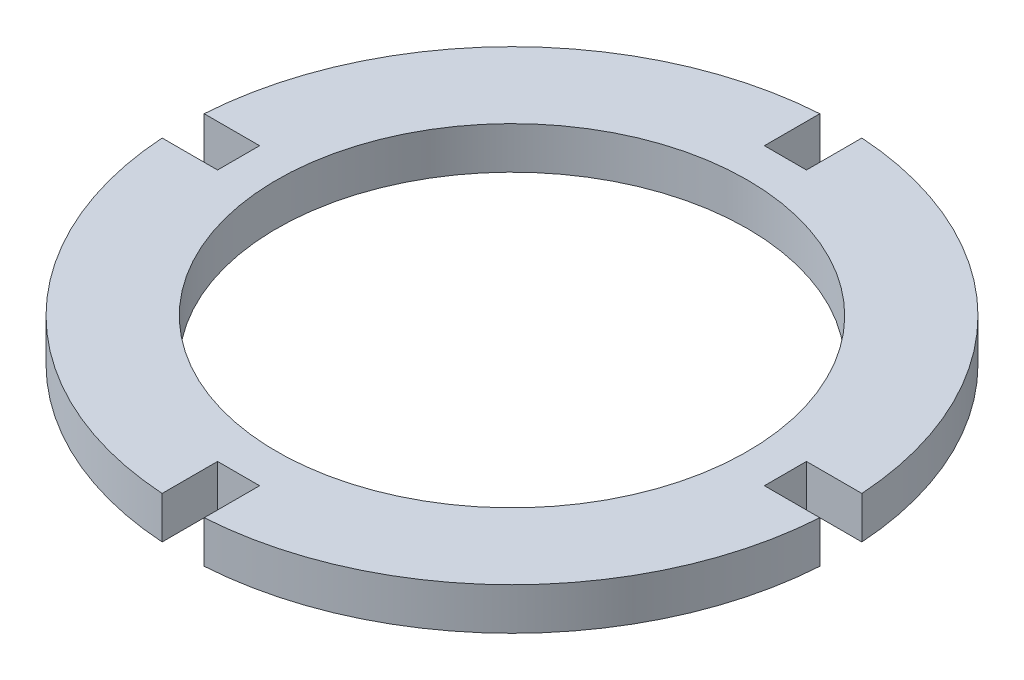
ISO-10303-21;
HEADER;
FILE_DESCRIPTION(('STEP AP214'),'2;1');
FILE_NAME('part.step','',(''),(''),'','','');
FILE_SCHEMA(('AUTOMOTIVE_DESIGN { 1 0 10303 214 1 1 1 1 }'));
ENDSEC;
DATA;
#1=APPLICATION_CONTEXT('core data for automotive mechanical design processes');
#2=APPLICATION_PROTOCOL_DEFINITION('international standard','automotive_design',2000,#1);
#3=PRODUCT_CONTEXT('',#1,'mechanical');
#4=PRODUCT('Part','Part','',(#3));
#5=PRODUCT_RELATED_PRODUCT_CATEGORY('part','',(#4));
#6=PRODUCT_DEFINITION_FORMATION('','',#4);
#7=PRODUCT_DEFINITION_CONTEXT('part definition',#1,'design');
#8=PRODUCT_DEFINITION('design','',#6,#7);
#9=PRODUCT_DEFINITION_SHAPE('','',#8);
#10=(LENGTH_UNIT() NAMED_UNIT(*) SI_UNIT(.MILLI.,.METRE.));
#11=(NAMED_UNIT(*) PLANE_ANGLE_UNIT() SI_UNIT($,.RADIAN.));
#12=(NAMED_UNIT(*) SI_UNIT($,.STERADIAN.) SOLID_ANGLE_UNIT());
#13=UNCERTAINTY_MEASURE_WITH_UNIT(LENGTH_MEASURE(1.E-05),#10,'distance_accuracy_value','');
#14=(GEOMETRIC_REPRESENTATION_CONTEXT(3) GLOBAL_UNCERTAINTY_ASSIGNED_CONTEXT((#13)) GLOBAL_UNIT_ASSIGNED_CONTEXT((#10,
#11,#12)) REPRESENTATION_CONTEXT('',''));
#15=CARTESIAN_POINT('',(0.,0.,0.));
#16=DIRECTION('',(0.,0.,1.));
#17=DIRECTION('',(1.,0.,0.));
#18=AXIS2_PLACEMENT_3D('',#15,#16,#17);
#19=CARTESIAN_POINT('',(0.,3.,0.));
#20=DIRECTION('',(0.,-1.,0.));
#21=DIRECTION('',(0.,0.,-1.));
#22=AXIS2_PLACEMENT_3D('',#19,#20,#21);
#23=CYLINDRICAL_SURFACE('',#22,23.5);
#24=CARTESIAN_POINT('',(0.,0.,0.));
#25=DIRECTION('',(0.,1.,0.));
#26=DIRECTION('',(0.,0.,1.));
#27=AXIS2_PLACEMENT_3D('',#24,#25,#26);
#28=CIRCLE('',#27,23.5);
#29=CARTESIAN_POINT('',(1.49999999999992,0.,23.4520787991172));
#30=VERTEX_POINT('',#29);
#31=CARTESIAN_POINT('',(23.4520787991172,0.,1.5));
#32=VERTEX_POINT('',#31);
#33=EDGE_CURVE('E260',#30,#32,#28,.T.);
#34=ORIENTED_EDGE('',*,*,#33,.T.);
#35=DIRECTION('',(0.,-1.,0.));
#36=VECTOR('',#35,1.);
#37=CARTESIAN_POINT('',(23.4520787991172,3.,1.5));
#38=LINE('',#37,#36);
#39=CARTESIAN_POINT('',(23.4520787991172,3.,1.5));
#40=VERTEX_POINT('',#39);
#41=EDGE_CURVE('E160',#32,#40,#38,.F.);
#42=ORIENTED_EDGE('',*,*,#41,.T.);
#43=CARTESIAN_POINT('',(0.,3.,0.));
#44=DIRECTION('',(0.,1.,0.));
#45=DIRECTION('',(0.,0.,1.));
#46=AXIS2_PLACEMENT_3D('',#43,#44,#45);
#47=CIRCLE('',#46,23.5);
#48=CARTESIAN_POINT('',(1.49999999999992,3.,23.4520787991172));
#49=VERTEX_POINT('',#48);
#50=EDGE_CURVE('E254',#49,#40,#47,.T.);
#51=ORIENTED_EDGE('',*,*,#50,.F.);
#52=DIRECTION('',(0.,-1.,0.));
#53=VECTOR('',#52,1.);
#54=CARTESIAN_POINT('',(1.49999999999992,3.,23.4520787991172));
#55=LINE('',#54,#53);
#56=EDGE_CURVE('E237',#49,#30,#55,.T.);
#57=ORIENTED_EDGE('',*,*,#56,.T.);
#58=EDGE_LOOP('',(#34,#42,#51,#57));
#59=FACE_BOUND('',#58,.T.);
#60=ADVANCED_FACE('F33',(#59),#23,.T.);
#61=CARTESIAN_POINT('',(-23.4520787991172,0.,1.49999999999984));
#62=VERTEX_POINT('',#61);
#63=CARTESIAN_POINT('',(-1.50000000000008,0.,23.4520787991171));
#64=VERTEX_POINT('',#63);
#65=EDGE_CURVE('E251',#62,#64,#28,.T.);
#66=ORIENTED_EDGE('',*,*,#65,.T.);
#67=DIRECTION('',(0.,-1.,0.));
#68=VECTOR('',#67,1.);
#69=CARTESIAN_POINT('',(-1.50000000000008,3.,23.4520787991171));
#70=LINE('',#69,#68);
#71=CARTESIAN_POINT('',(-1.50000000000008,3.,23.4520787991171));
#72=VERTEX_POINT('',#71);
#73=EDGE_CURVE('E240',#64,#72,#70,.F.);
#74=ORIENTED_EDGE('',*,*,#73,.T.);
#75=CARTESIAN_POINT('',(-23.4520787991172,3.,1.49999999999984));
#76=VERTEX_POINT('',#75);
#77=EDGE_CURVE('E259',#76,#72,#47,.T.);
#78=ORIENTED_EDGE('',*,*,#77,.F.);
#79=DIRECTION('',(0.,-1.,0.));
#80=VECTOR('',#79,1.);
#81=CARTESIAN_POINT('',(-23.4520787991172,3.,1.49999999999984));
#82=LINE('',#81,#80);
#83=EDGE_CURVE('E231',#76,#62,#82,.T.);
#84=ORIENTED_EDGE('',*,*,#83,.T.);
#85=EDGE_LOOP('',(#66,#74,#78,#84));
#86=FACE_BOUND('',#85,.T.);
#87=ADVANCED_FACE('F287',(#86),#23,.T.);
#88=CARTESIAN_POINT('',(-1.49999999999975,0.,-23.4520787991172));
#89=VERTEX_POINT('',#88);
#90=CARTESIAN_POINT('',(-23.4520787991171,0.,-1.50000000000016));
#91=VERTEX_POINT('',#90);
#92=EDGE_CURVE('E289',#89,#91,#28,.T.);
#93=ORIENTED_EDGE('',*,*,#92,.T.);
#94=DIRECTION('',(0.,-1.,0.));
#95=VECTOR('',#94,1.);
#96=CARTESIAN_POINT('',(-23.4520787991171,3.,-1.50000000000016));
#97=LINE('',#96,#95);
#98=CARTESIAN_POINT('',(-23.4520787991171,3.,-1.50000000000016));
#99=VERTEX_POINT('',#98);
#100=EDGE_CURVE('E234',#91,#99,#97,.F.);
#101=ORIENTED_EDGE('',*,*,#100,.T.);
#102=CARTESIAN_POINT('',(-1.49999999999975,3.,-23.4520787991172));
#103=VERTEX_POINT('',#102);
#104=EDGE_CURVE('E304',#103,#99,#47,.T.);
#105=ORIENTED_EDGE('',*,*,#104,.F.);
#106=DIRECTION('',(0.,-1.,0.));
#107=VECTOR('',#106,1.);
#108=CARTESIAN_POINT('',(-1.49999999999975,3.,-23.4520787991172));
#109=LINE('',#108,#107);
#110=EDGE_CURVE('E153',#103,#89,#109,.T.);
#111=ORIENTED_EDGE('',*,*,#110,.T.);
#112=EDGE_LOOP('',(#93,#101,#105,#111));
#113=FACE_BOUND('',#112,.T.);
#114=ADVANCED_FACE('F309',(#113),#23,.T.);
#115=CARTESIAN_POINT('',(23.4520787991172,3.,-1.5));
#116=VERTEX_POINT('',#115);
#117=CARTESIAN_POINT('',(1.50000000000025,3.,-23.4520787991171));
#118=VERTEX_POINT('',#117);
#119=EDGE_CURVE('E258',#116,#118,#47,.T.);
#120=ORIENTED_EDGE('',*,*,#119,.F.);
#121=DIRECTION('',(0.,-1.,0.));
#122=VECTOR('',#121,1.);
#123=CARTESIAN_POINT('',(23.4520787991172,3.,-1.5));
#124=LINE('',#123,#122);
#125=CARTESIAN_POINT('',(23.4520787991172,0.,-1.5));
#126=VERTEX_POINT('',#125);
#127=EDGE_CURVE('E243',#116,#126,#124,.T.);
#128=ORIENTED_EDGE('',*,*,#127,.T.);
#129=CARTESIAN_POINT('',(1.50000000000025,0.,-23.4520787991171));
#130=VERTEX_POINT('',#129);
#131=EDGE_CURVE('E262',#126,#130,#28,.T.);
#132=ORIENTED_EDGE('',*,*,#131,.T.);
#133=DIRECTION('',(0.,-1.,0.));
#134=VECTOR('',#133,1.);
#135=CARTESIAN_POINT('',(1.50000000000025,3.,-23.4520787991171));
#136=LINE('',#135,#134);
#137=EDGE_CURVE('E228',#130,#118,#136,.F.);
#138=ORIENTED_EDGE('',*,*,#137,.T.);
#139=EDGE_LOOP('',(#120,#128,#132,#138));
#140=FACE_BOUND('',#139,.T.);
#141=ADVANCED_FACE('F35',(#140),#23,.T.);
#142=CARTESIAN_POINT('',(0.,3.,0.));
#143=DIRECTION('',(0.,1.,0.));
#144=DIRECTION('',(0.,0.,1.));
#145=AXIS2_PLACEMENT_3D('',#142,#143,#144);
#146=PLANE('',#145);
#147=DIRECTION('',(1.,0.,0.));
#148=VECTOR('',#147,1.);
#149=CARTESIAN_POINT('',(19.5,3.,1.5));
#150=LINE('',#149,#148);
#151=CARTESIAN_POINT('',(19.5,3.,1.5));
#152=VERTEX_POINT('',#151);
#153=EDGE_CURVE('E167',#152,#40,#150,.T.);
#154=ORIENTED_EDGE('',*,*,#153,.F.);
#155=DIRECTION('',(0.,0.,1.));
#156=VECTOR('',#155,1.);
#157=CARTESIAN_POINT('',(19.5,3.,-1.5));
#158=LINE('',#157,#156);
#159=CARTESIAN_POINT('',(19.5,3.,-1.5));
#160=VERTEX_POINT('',#159);
#161=EDGE_CURVE('E150',#160,#152,#158,.T.);
#162=ORIENTED_EDGE('',*,*,#161,.F.);
#163=DIRECTION('',(-1.,0.,0.));
#164=VECTOR('',#163,1.);
#165=CARTESIAN_POINT('',(19.5,3.,-1.5));
#166=LINE('',#165,#164);
#167=EDGE_CURVE('E171',#116,#160,#166,.T.);
#168=ORIENTED_EDGE('',*,*,#167,.F.);
#169=ORIENTED_EDGE('',*,*,#119,.T.);
#170=DIRECTION('',(0.,0.,-1.));
#171=VECTOR('',#170,1.);
#172=CARTESIAN_POINT('',(1.50000000000021,3.,-19.5));
#173=LINE('',#172,#171);
#174=CARTESIAN_POINT('',(1.50000000000021,3.,-19.5));
#175=VERTEX_POINT('',#174);
#176=EDGE_CURVE('E217',#175,#118,#173,.T.);
#177=ORIENTED_EDGE('',*,*,#176,.F.);
#178=DIRECTION('',(1.,0.,0.));
#179=VECTOR('',#178,1.);
#180=CARTESIAN_POINT('',(-1.49999999999979,3.,-19.5));
#181=LINE('',#180,#179);
#182=CARTESIAN_POINT('',(-1.49999999999979,3.,-19.5));
#183=VERTEX_POINT('',#182);
#184=EDGE_CURVE('E213',#183,#175,#181,.T.);
#185=ORIENTED_EDGE('',*,*,#184,.F.);
#186=DIRECTION('',(0.,0.,1.));
#187=VECTOR('',#186,1.);
#188=CARTESIAN_POINT('',(-1.49999999999979,3.,-19.5));
#189=LINE('',#188,#187);
#190=EDGE_CURVE('E219',#103,#183,#189,.T.);
#191=ORIENTED_EDGE('',*,*,#190,.F.);
#192=ORIENTED_EDGE('',*,*,#104,.T.);
#193=DIRECTION('',(-1.,0.,0.));
#194=VECTOR('',#193,1.);
#195=CARTESIAN_POINT('',(-19.5,3.,-1.50000000000014));
#196=LINE('',#195,#194);
#197=CARTESIAN_POINT('',(-19.5,3.,-1.50000000000014));
#198=VERTEX_POINT('',#197);
#199=EDGE_CURVE('E199',#198,#99,#196,.T.);
#200=ORIENTED_EDGE('',*,*,#199,.F.);
#201=DIRECTION('',(0.,0.,-1.));
#202=VECTOR('',#201,1.);
#203=CARTESIAN_POINT('',(-19.5,3.,1.49999999999986));
#204=LINE('',#203,#202);
#205=CARTESIAN_POINT('',(-19.5,3.,1.49999999999986));
#206=VERTEX_POINT('',#205);
#207=EDGE_CURVE('E195',#206,#198,#204,.T.);
#208=ORIENTED_EDGE('',*,*,#207,.F.);
#209=DIRECTION('',(1.,0.,0.));
#210=VECTOR('',#209,1.);
#211=CARTESIAN_POINT('',(-19.5,3.,1.49999999999986));
#212=LINE('',#211,#210);
#213=EDGE_CURVE('E201',#76,#206,#212,.T.);
#214=ORIENTED_EDGE('',*,*,#213,.F.);
#215=ORIENTED_EDGE('',*,*,#77,.T.);
#216=DIRECTION('',(0.,0.,1.));
#217=VECTOR('',#216,1.);
#218=CARTESIAN_POINT('',(-1.50000000000007,3.,19.5));
#219=LINE('',#218,#217);
#220=CARTESIAN_POINT('',(-1.50000000000007,3.,19.5));
#221=VERTEX_POINT('',#220);
#222=EDGE_CURVE('E182',#221,#72,#219,.T.);
#223=ORIENTED_EDGE('',*,*,#222,.F.);
#224=DIRECTION('',(-1.,0.,0.));
#225=VECTOR('',#224,1.);
#226=CARTESIAN_POINT('',(1.49999999999993,3.,19.5));
#227=LINE('',#226,#225);
#228=CARTESIAN_POINT('',(1.49999999999993,3.,19.5));
#229=VERTEX_POINT('',#228);
#230=EDGE_CURVE('E179',#229,#221,#227,.T.);
#231=ORIENTED_EDGE('',*,*,#230,.F.);
#232=DIRECTION('',(0.,0.,-1.));
#233=VECTOR('',#232,1.);
#234=CARTESIAN_POINT('',(1.49999999999993,3.,19.5));
#235=LINE('',#234,#233);
#236=EDGE_CURVE('E184',#49,#229,#235,.T.);
#237=ORIENTED_EDGE('',*,*,#236,.F.);
#238=ORIENTED_EDGE('',*,*,#50,.T.);
#239=EDGE_LOOP('',(#154,#162,#168,#169,#177,#185,#191,#192,#200,#208,#214,#215,#223,#231,#237,#238));
#240=FACE_BOUND('',#239,.T.);
#241=CARTESIAN_POINT('',(0.,3.,0.));
#242=DIRECTION('',(0.,-1.,0.));
#243=DIRECTION('',(0.,0.,-1.));
#244=AXIS2_PLACEMENT_3D('',#241,#242,#243);
#245=CIRCLE('',#244,16.78);
#246=CARTESIAN_POINT('',(0.,3.,-16.78));
#247=VERTEX_POINT('',#246);
#248=EDGE_CURVE('E248',#247,#247,#245,.T.);
#249=ORIENTED_EDGE('',*,*,#248,.T.);
#250=EDGE_LOOP('',(#249));
#251=FACE_BOUND('',#250,.T.);
#252=ADVANCED_FACE('F274',(#240,#251),#146,.T.);
#253=CARTESIAN_POINT('',(0.,0.,0.));
#254=DIRECTION('',(0.,1.,0.));
#255=DIRECTION('',(0.,0.,1.));
#256=AXIS2_PLACEMENT_3D('',#253,#254,#255);
#257=PLANE('',#256);
#258=CARTESIAN_POINT('',(0.,0.,0.));
#259=DIRECTION('',(0.,-1.,0.));
#260=DIRECTION('',(0.,0.,-1.));
#261=AXIS2_PLACEMENT_3D('',#258,#259,#260);
#262=CIRCLE('',#261,16.78);
#263=CARTESIAN_POINT('',(0.,0.,-16.78));
#264=VERTEX_POINT('',#263);
#265=EDGE_CURVE('E247',#264,#264,#262,.T.);
#266=ORIENTED_EDGE('',*,*,#265,.F.);
#267=EDGE_LOOP('',(#266));
#268=FACE_BOUND('',#267,.T.);
#269=DIRECTION('',(0.,0.,1.));
#270=VECTOR('',#269,1.);
#271=CARTESIAN_POINT('',(19.5,0.,-1.5));
#272=LINE('',#271,#270);
#273=CARTESIAN_POINT('',(19.5,0.,-1.5));
#274=VERTEX_POINT('',#273);
#275=CARTESIAN_POINT('',(19.5,0.,1.5));
#276=VERTEX_POINT('',#275);
#277=EDGE_CURVE('E48',#274,#276,#272,.T.);
#278=ORIENTED_EDGE('',*,*,#277,.T.);
#279=DIRECTION('',(1.,0.,0.));
#280=VECTOR('',#279,1.);
#281=CARTESIAN_POINT('',(19.5,0.,1.5));
#282=LINE('',#281,#280);
#283=EDGE_CURVE('E157',#276,#32,#282,.T.);
#284=ORIENTED_EDGE('',*,*,#283,.T.);
#285=ORIENTED_EDGE('',*,*,#33,.F.);
#286=DIRECTION('',(0.,0.,-1.));
#287=VECTOR('',#286,1.);
#288=CARTESIAN_POINT('',(1.5,0.,0.));
#289=LINE('',#288,#287);
#290=CARTESIAN_POINT('',(1.49999999999993,0.,19.5));
#291=VERTEX_POINT('',#290);
#292=EDGE_CURVE('E41',#30,#291,#289,.T.);
#293=ORIENTED_EDGE('',*,*,#292,.T.);
#294=DIRECTION('',(-1.,0.,0.));
#295=VECTOR('',#294,1.);
#296=CARTESIAN_POINT('',(1.49999999999993,0.,19.5));
#297=LINE('',#296,#295);
#298=CARTESIAN_POINT('',(-1.50000000000007,0.,19.5));
#299=VERTEX_POINT('',#298);
#300=EDGE_CURVE('E56',#291,#299,#297,.T.);
#301=ORIENTED_EDGE('',*,*,#300,.T.);
#302=DIRECTION('',(0.,0.,1.));
#303=VECTOR('',#302,1.);
#304=CARTESIAN_POINT('',(-1.50000000000007,0.,19.5));
#305=LINE('',#304,#303);
#306=EDGE_CURVE('E176',#299,#64,#305,.T.);
#307=ORIENTED_EDGE('',*,*,#306,.T.);
#308=ORIENTED_EDGE('',*,*,#65,.F.);
#309=DIRECTION('',(1.,0.,0.));
#310=VECTOR('',#309,1.);
#311=CARTESIAN_POINT('',(0.,0.,1.5));
#312=LINE('',#311,#310);
#313=CARTESIAN_POINT('',(-19.5,0.,1.49999999999986));
#314=VERTEX_POINT('',#313);
#315=EDGE_CURVE('E265',#62,#314,#312,.T.);
#316=ORIENTED_EDGE('',*,*,#315,.T.);
#317=DIRECTION('',(0.,0.,-1.));
#318=VECTOR('',#317,1.);
#319=CARTESIAN_POINT('',(-19.5,0.,1.49999999999986));
#320=LINE('',#319,#318);
#321=CARTESIAN_POINT('',(-19.5,0.,-1.50000000000014));
#322=VERTEX_POINT('',#321);
#323=EDGE_CURVE('E194',#314,#322,#320,.T.);
#324=ORIENTED_EDGE('',*,*,#323,.T.);
#325=DIRECTION('',(-1.,0.,0.));
#326=VECTOR('',#325,1.);
#327=CARTESIAN_POINT('',(-19.5,0.,-1.50000000000014));
#328=LINE('',#327,#326);
#329=EDGE_CURVE('E191',#322,#91,#328,.T.);
#330=ORIENTED_EDGE('',*,*,#329,.T.);
#331=ORIENTED_EDGE('',*,*,#92,.F.);
#332=DIRECTION('',(0.,0.,1.));
#333=VECTOR('',#332,1.);
#334=CARTESIAN_POINT('',(-1.5,0.,0.));
#335=LINE('',#334,#333);
#336=CARTESIAN_POINT('',(-1.49999999999979,0.,-19.5));
#337=VERTEX_POINT('',#336);
#338=EDGE_CURVE('E257',#89,#337,#335,.T.);
#339=ORIENTED_EDGE('',*,*,#338,.T.);
#340=DIRECTION('',(1.,0.,0.));
#341=VECTOR('',#340,1.);
#342=CARTESIAN_POINT('',(-1.49999999999979,0.,-19.5));
#343=LINE('',#342,#341);
#344=CARTESIAN_POINT('',(1.50000000000021,0.,-19.5));
#345=VERTEX_POINT('',#344);
#346=EDGE_CURVE('E212',#337,#345,#343,.T.);
#347=ORIENTED_EDGE('',*,*,#346,.T.);
#348=DIRECTION('',(0.,0.,-1.));
#349=VECTOR('',#348,1.);
#350=CARTESIAN_POINT('',(1.50000000000021,0.,-19.5));
#351=LINE('',#350,#349);
#352=EDGE_CURVE('E209',#345,#130,#351,.T.);
#353=ORIENTED_EDGE('',*,*,#352,.T.);
#354=ORIENTED_EDGE('',*,*,#131,.F.);
#355=DIRECTION('',(-1.,0.,0.));
#356=VECTOR('',#355,1.);
#357=CARTESIAN_POINT('',(0.,0.,-1.5));
#358=LINE('',#357,#356);
#359=EDGE_CURVE('E11',#126,#274,#358,.T.);
#360=ORIENTED_EDGE('',*,*,#359,.T.);
#361=EDGE_LOOP('',(#278,#284,#285,#293,#301,#307,#308,#316,#324,#330,#331,#339,#347,#353,#354,#360));
#362=FACE_BOUND('',#361,.T.);
#363=ADVANCED_FACE('F165',(#268,#362),#257,.F.);
#364=CARTESIAN_POINT('',(0.,3.,0.));
#365=DIRECTION('',(0.,-1.,0.));
#366=DIRECTION('',(0.,0.,-1.));
#367=AXIS2_PLACEMENT_3D('',#364,#365,#366);
#368=CYLINDRICAL_SURFACE('',#367,16.78);
#369=ORIENTED_EDGE('',*,*,#248,.F.);
#370=EDGE_LOOP('',(#369));
#371=FACE_BOUND('',#370,.T.);
#372=ORIENTED_EDGE('',*,*,#265,.T.);
#373=EDGE_LOOP('',(#372));
#374=FACE_BOUND('',#373,.T.);
#375=ADVANCED_FACE('F353',(#371,#374),#368,.F.);
#376=CARTESIAN_POINT('',(1.50000000000021,0.,-19.5));
#377=DIRECTION('',(1.,0.,0.));
#378=DIRECTION('',(0.,0.,-1.));
#379=AXIS2_PLACEMENT_3D('',#376,#377,#378);
#380=PLANE('',#379);
#381=ORIENTED_EDGE('',*,*,#352,.F.);
#382=DIRECTION('',(0.,1.,0.));
#383=VECTOR('',#382,1.);
#384=CARTESIAN_POINT('',(1.50000000000021,0.,-19.5));
#385=LINE('',#384,#383);
#386=EDGE_CURVE('E202',#345,#175,#385,.T.);
#387=ORIENTED_EDGE('',*,*,#386,.T.);
#388=ORIENTED_EDGE('',*,*,#176,.T.);
#389=ORIENTED_EDGE('',*,*,#137,.F.);
#390=EDGE_LOOP('',(#381,#387,#388,#389));
#391=FACE_BOUND('',#390,.T.);
#392=ADVANCED_FACE('F299',(#391),#380,.F.);
#393=CARTESIAN_POINT('',(-1.49999999999979,0.,-19.5));
#394=DIRECTION('',(-1.,0.,0.));
#395=DIRECTION('',(0.,0.,1.));
#396=AXIS2_PLACEMENT_3D('',#393,#394,#395);
#397=PLANE('',#396);
#398=ORIENTED_EDGE('',*,*,#190,.T.);
#399=DIRECTION('',(0.,1.,0.));
#400=VECTOR('',#399,1.);
#401=CARTESIAN_POINT('',(-1.49999999999979,0.,-19.5));
#402=LINE('',#401,#400);
#403=EDGE_CURVE('E216',#337,#183,#402,.T.);
#404=ORIENTED_EDGE('',*,*,#403,.F.);
#405=ORIENTED_EDGE('',*,*,#338,.F.);
#406=ORIENTED_EDGE('',*,*,#110,.F.);
#407=EDGE_LOOP('',(#398,#404,#405,#406));
#408=FACE_BOUND('',#407,.T.);
#409=ADVANCED_FACE('F370',(#408),#397,.F.);
#410=CARTESIAN_POINT('',(-1.49999999999979,0.,-19.5));
#411=DIRECTION('',(0.,0.,1.));
#412=DIRECTION('',(1.,0.,0.));
#413=AXIS2_PLACEMENT_3D('',#410,#411,#412);
#414=PLANE('',#413);
#415=ORIENTED_EDGE('',*,*,#184,.T.);
#416=ORIENTED_EDGE('',*,*,#386,.F.);
#417=ORIENTED_EDGE('',*,*,#346,.F.);
#418=ORIENTED_EDGE('',*,*,#403,.T.);
#419=EDGE_LOOP('',(#415,#416,#417,#418));
#420=FACE_BOUND('',#419,.T.);
#421=ADVANCED_FACE('F325',(#420),#414,.F.);
#422=CARTESIAN_POINT('',(-19.5,0.,-1.50000000000014));
#423=DIRECTION('',(0.,0.,-1.));
#424=DIRECTION('',(-1.,0.,0.));
#425=AXIS2_PLACEMENT_3D('',#422,#423,#424);
#426=PLANE('',#425);
#427=ORIENTED_EDGE('',*,*,#329,.F.);
#428=DIRECTION('',(0.,1.,0.));
#429=VECTOR('',#428,1.);
#430=CARTESIAN_POINT('',(-19.5,0.,-1.50000000000014));
#431=LINE('',#430,#429);
#432=EDGE_CURVE('E185',#322,#198,#431,.T.);
#433=ORIENTED_EDGE('',*,*,#432,.T.);
#434=ORIENTED_EDGE('',*,*,#199,.T.);
#435=ORIENTED_EDGE('',*,*,#100,.F.);
#436=EDGE_LOOP('',(#427,#433,#434,#435));
#437=FACE_BOUND('',#436,.T.);
#438=ADVANCED_FACE('F312',(#437),#426,.F.);
#439=CARTESIAN_POINT('',(-19.5,0.,1.49999999999986));
#440=DIRECTION('',(0.,0.,1.));
#441=DIRECTION('',(1.,0.,0.));
#442=AXIS2_PLACEMENT_3D('',#439,#440,#441);
#443=PLANE('',#442);
#444=ORIENTED_EDGE('',*,*,#213,.T.);
#445=DIRECTION('',(0.,1.,0.));
#446=VECTOR('',#445,1.);
#447=CARTESIAN_POINT('',(-19.5,0.,1.49999999999986));
#448=LINE('',#447,#446);
#449=EDGE_CURVE('E198',#314,#206,#448,.T.);
#450=ORIENTED_EDGE('',*,*,#449,.F.);
#451=ORIENTED_EDGE('',*,*,#315,.F.);
#452=ORIENTED_EDGE('',*,*,#83,.F.);
#453=EDGE_LOOP('',(#444,#450,#451,#452));
#454=FACE_BOUND('',#453,.T.);
#455=ADVANCED_FACE('F317',(#454),#443,.F.);
#456=CARTESIAN_POINT('',(-19.5,0.,1.49999999999986));
#457=DIRECTION('',(1.,0.,0.));
#458=DIRECTION('',(0.,0.,-1.));
#459=AXIS2_PLACEMENT_3D('',#456,#457,#458);
#460=PLANE('',#459);
#461=ORIENTED_EDGE('',*,*,#207,.T.);
#462=ORIENTED_EDGE('',*,*,#432,.F.);
#463=ORIENTED_EDGE('',*,*,#323,.F.);
#464=ORIENTED_EDGE('',*,*,#449,.T.);
#465=EDGE_LOOP('',(#461,#462,#463,#464));
#466=FACE_BOUND('',#465,.T.);
#467=ADVANCED_FACE('F315',(#466),#460,.F.);
#468=CARTESIAN_POINT('',(-1.50000000000007,0.,19.5));
#469=DIRECTION('',(-1.,0.,0.));
#470=DIRECTION('',(0.,0.,1.));
#471=AXIS2_PLACEMENT_3D('',#468,#469,#470);
#472=PLANE('',#471);
#473=ORIENTED_EDGE('',*,*,#306,.F.);
#474=DIRECTION('',(0.,1.,0.));
#475=VECTOR('',#474,1.);
#476=CARTESIAN_POINT('',(-1.50000000000007,0.,19.5));
#477=LINE('',#476,#475);
#478=EDGE_CURVE('E173',#299,#221,#477,.T.);
#479=ORIENTED_EDGE('',*,*,#478,.T.);
#480=ORIENTED_EDGE('',*,*,#222,.T.);
#481=ORIENTED_EDGE('',*,*,#73,.F.);
#482=EDGE_LOOP('',(#473,#479,#480,#481));
#483=FACE_BOUND('',#482,.T.);
#484=ADVANCED_FACE('F284',(#483),#472,.F.);
#485=CARTESIAN_POINT('',(1.49999999999993,0.,19.5));
#486=DIRECTION('',(1.,0.,0.));
#487=DIRECTION('',(0.,0.,-1.));
#488=AXIS2_PLACEMENT_3D('',#485,#486,#487);
#489=PLANE('',#488);
#490=ORIENTED_EDGE('',*,*,#236,.T.);
#491=DIRECTION('',(0.,1.,0.));
#492=VECTOR('',#491,1.);
#493=CARTESIAN_POINT('',(1.49999999999993,0.,19.5));
#494=LINE('',#493,#492);
#495=EDGE_CURVE('E181',#291,#229,#494,.T.);
#496=ORIENTED_EDGE('',*,*,#495,.F.);
#497=ORIENTED_EDGE('',*,*,#292,.F.);
#498=ORIENTED_EDGE('',*,*,#56,.F.);
#499=EDGE_LOOP('',(#490,#496,#497,#498));
#500=FACE_BOUND('',#499,.T.);
#501=ADVANCED_FACE('F269',(#500),#489,.F.);
#502=CARTESIAN_POINT('',(1.49999999999993,0.,19.5));
#503=DIRECTION('',(0.,0.,-1.));
#504=DIRECTION('',(-1.,0.,0.));
#505=AXIS2_PLACEMENT_3D('',#502,#503,#504);
#506=PLANE('',#505);
#507=ORIENTED_EDGE('',*,*,#230,.T.);
#508=ORIENTED_EDGE('',*,*,#478,.F.);
#509=ORIENTED_EDGE('',*,*,#300,.F.);
#510=ORIENTED_EDGE('',*,*,#495,.T.);
#511=EDGE_LOOP('',(#507,#508,#509,#510));
#512=FACE_BOUND('',#511,.T.);
#513=ADVANCED_FACE('F278',(#512),#506,.F.);
#514=CARTESIAN_POINT('',(19.5,0.,1.5));
#515=DIRECTION('',(0.,0.,1.));
#516=DIRECTION('',(1.,0.,0.));
#517=AXIS2_PLACEMENT_3D('',#514,#515,#516);
#518=PLANE('',#517);
#519=ORIENTED_EDGE('',*,*,#283,.F.);
#520=DIRECTION('',(0.,1.,0.));
#521=VECTOR('',#520,1.);
#522=CARTESIAN_POINT('',(19.5,0.,1.5));
#523=LINE('',#522,#521);
#524=EDGE_CURVE('E146',#276,#152,#523,.T.);
#525=ORIENTED_EDGE('',*,*,#524,.T.);
#526=ORIENTED_EDGE('',*,*,#153,.T.);
#527=ORIENTED_EDGE('',*,*,#41,.F.);
#528=EDGE_LOOP('',(#519,#525,#526,#527));
#529=FACE_BOUND('',#528,.T.);
#530=ADVANCED_FACE('F158',(#529),#518,.F.);
#531=CARTESIAN_POINT('',(19.5,0.,-1.5));
#532=DIRECTION('',(0.,0.,-1.));
#533=DIRECTION('',(-1.,0.,0.));
#534=AXIS2_PLACEMENT_3D('',#531,#532,#533);
#535=PLANE('',#534);
#536=ORIENTED_EDGE('',*,*,#167,.T.);
#537=DIRECTION('',(0.,1.,0.));
#538=VECTOR('',#537,1.);
#539=CARTESIAN_POINT('',(19.5,0.,-1.5));
#540=LINE('',#539,#538);
#541=EDGE_CURVE('E154',#274,#160,#540,.T.);
#542=ORIENTED_EDGE('',*,*,#541,.F.);
#543=ORIENTED_EDGE('',*,*,#359,.F.);
#544=ORIENTED_EDGE('',*,*,#127,.F.);
#545=EDGE_LOOP('',(#536,#542,#543,#544));
#546=FACE_BOUND('',#545,.T.);
#547=ADVANCED_FACE('F431',(#546),#535,.F.);
#548=CARTESIAN_POINT('',(19.5,0.,-1.5));
#549=DIRECTION('',(-1.,0.,0.));
#550=DIRECTION('',(0.,0.,1.));
#551=AXIS2_PLACEMENT_3D('',#548,#549,#550);
#552=PLANE('',#551);
#553=ORIENTED_EDGE('',*,*,#161,.T.);
#554=ORIENTED_EDGE('',*,*,#524,.F.);
#555=ORIENTED_EDGE('',*,*,#277,.F.);
#556=ORIENTED_EDGE('',*,*,#541,.T.);
#557=EDGE_LOOP('',(#553,#554,#555,#556));
#558=FACE_BOUND('',#557,.T.);
#559=ADVANCED_FACE('F148',(#558),#552,.F.);
#560=CLOSED_SHELL('',(#60,#87,#114,#141,#252,#363,#375,#392,#409,#421,#438,#455,#467,#484,#501,
#513,#530,#547,#559));
#561=MANIFOLD_SOLID_BREP('B2',#560);
#562=ADVANCED_BREP_SHAPE_REPRESENTATION('',(#18,#561),#14);
#563=SHAPE_DEFINITION_REPRESENTATION(#9,#562);
ENDSEC;
END-ISO-10303-21;
